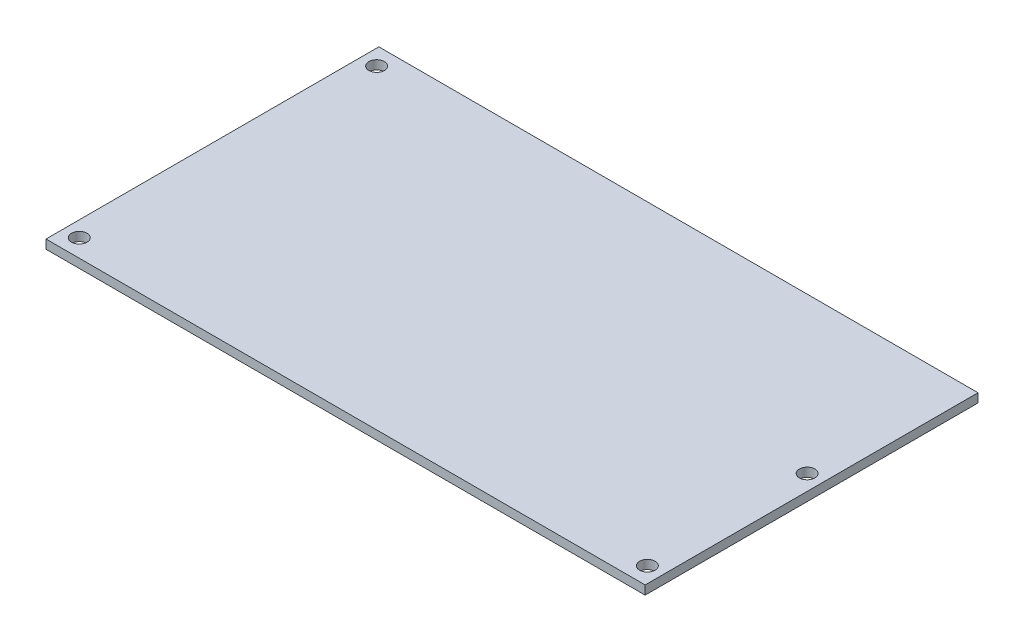
ISO-10303-21;
HEADER;
FILE_DESCRIPTION(('STEP AP214'),'2;1');
FILE_NAME('part.step','',(''),(''),'','','');
FILE_SCHEMA(('AUTOMOTIVE_DESIGN { 1 0 10303 214 1 1 1 1 }'));
ENDSEC;
DATA;
#1=APPLICATION_CONTEXT('core data for automotive mechanical design processes');
#2=APPLICATION_PROTOCOL_DEFINITION('international standard','automotive_design',2000,#1);
#3=PRODUCT_CONTEXT('',#1,'mechanical');
#4=PRODUCT('Part','Part','',(#3));
#5=PRODUCT_RELATED_PRODUCT_CATEGORY('part','',(#4));
#6=PRODUCT_DEFINITION_FORMATION('','',#4);
#7=PRODUCT_DEFINITION_CONTEXT('part definition',#1,'design');
#8=PRODUCT_DEFINITION('design','',#6,#7);
#9=PRODUCT_DEFINITION_SHAPE('','',#8);
#10=(LENGTH_UNIT() NAMED_UNIT(*) SI_UNIT(.MILLI.,.METRE.));
#11=(NAMED_UNIT(*) PLANE_ANGLE_UNIT() SI_UNIT($,.RADIAN.));
#12=(NAMED_UNIT(*) SI_UNIT($,.STERADIAN.) SOLID_ANGLE_UNIT());
#13=UNCERTAINTY_MEASURE_WITH_UNIT(LENGTH_MEASURE(1.E-05),#10,'distance_accuracy_value','');
#14=(GEOMETRIC_REPRESENTATION_CONTEXT(3) GLOBAL_UNCERTAINTY_ASSIGNED_CONTEXT((#13)) GLOBAL_UNIT_ASSIGNED_CONTEXT((#10,
#11,#12)) REPRESENTATION_CONTEXT('',''));
#15=CARTESIAN_POINT('',(0.,0.,0.));
#16=DIRECTION('',(0.,0.,1.));
#17=DIRECTION('',(1.,0.,0.));
#18=AXIS2_PLACEMENT_3D('',#15,#16,#17);
#19=CARTESIAN_POINT('',(0.,2.,0.));
#20=DIRECTION('',(0.,1.,0.));
#21=DIRECTION('',(0.,0.,1.));
#22=AXIS2_PLACEMENT_3D('',#19,#20,#21);
#23=PLANE('',#22);
#24=CARTESIAN_POINT('',(64.,2.,33.5));
#25=DIRECTION('',(0.,1.,0.));
#26=DIRECTION('',(0.,0.,1.));
#27=AXIS2_PLACEMENT_3D('',#24,#25,#26);
#28=CIRCLE('',#27,1.75);
#29=CARTESIAN_POINT('',(64.,2.,35.25));
#30=VERTEX_POINT('',#29);
#31=EDGE_CURVE('E122',#30,#30,#28,.T.);
#32=ORIENTED_EDGE('',*,*,#31,.F.);
#33=EDGE_LOOP('',(#32));
#34=FACE_BOUND('',#33,.T.);
#35=CARTESIAN_POINT('',(-64.,2.,33.5));
#36=DIRECTION('',(0.,1.,0.));
#37=DIRECTION('',(0.,0.,1.));
#38=AXIS2_PLACEMENT_3D('',#35,#36,#37);
#39=CIRCLE('',#38,1.75);
#40=CARTESIAN_POINT('',(-64.,2.,35.25));
#41=VERTEX_POINT('',#40);
#42=EDGE_CURVE('E101',#41,#41,#39,.T.);
#43=ORIENTED_EDGE('',*,*,#42,.F.);
#44=EDGE_LOOP('',(#43));
#45=FACE_BOUND('',#44,.T.);
#46=DIRECTION('',(0.,0.,-1.));
#47=VECTOR('',#46,1.);
#48=CARTESIAN_POINT('',(67.5,2.,-37.5));
#49=LINE('',#48,#47);
#50=CARTESIAN_POINT('',(67.5,2.,37.5));
#51=VERTEX_POINT('',#50);
#52=CARTESIAN_POINT('',(67.5,2.,-37.5));
#53=VERTEX_POINT('',#52);
#54=EDGE_CURVE('E86',#51,#53,#49,.T.);
#55=ORIENTED_EDGE('',*,*,#54,.T.);
#56=DIRECTION('',(-1.,0.,0.));
#57=VECTOR('',#56,1.);
#58=CARTESIAN_POINT('',(-67.5,2.,-37.5));
#59=LINE('',#58,#57);
#60=CARTESIAN_POINT('',(-67.5,2.,-37.5));
#61=VERTEX_POINT('',#60);
#62=EDGE_CURVE('E81',#53,#61,#59,.T.);
#63=ORIENTED_EDGE('',*,*,#62,.T.);
#64=DIRECTION('',(0.,0.,1.));
#65=VECTOR('',#64,1.);
#66=CARTESIAN_POINT('',(-67.5,2.,-37.5));
#67=LINE('',#66,#65);
#68=CARTESIAN_POINT('',(-67.5,2.,37.5));
#69=VERTEX_POINT('',#68);
#70=EDGE_CURVE('E84',#61,#69,#67,.T.);
#71=ORIENTED_EDGE('',*,*,#70,.T.);
#72=DIRECTION('',(1.,0.,0.));
#73=VECTOR('',#72,1.);
#74=CARTESIAN_POINT('',(-67.5,2.,37.5));
#75=LINE('',#74,#73);
#76=EDGE_CURVE('E51',#69,#51,#75,.T.);
#77=ORIENTED_EDGE('',*,*,#76,.T.);
#78=EDGE_LOOP('',(#55,#63,#71,#77));
#79=FACE_BOUND('',#78,.T.);
#80=CARTESIAN_POINT('',(-64.,2.,-33.5));
#81=DIRECTION('',(0.,1.,0.));
#82=DIRECTION('',(0.,0.,1.));
#83=AXIS2_PLACEMENT_3D('',#80,#81,#82);
#84=CIRCLE('',#83,1.75);
#85=CARTESIAN_POINT('',(-64.,2.,-31.75));
#86=VERTEX_POINT('',#85);
#87=EDGE_CURVE('E116',#86,#86,#84,.T.);
#88=ORIENTED_EDGE('',*,*,#87,.F.);
#89=EDGE_LOOP('',(#88));
#90=FACE_BOUND('',#89,.T.);
#91=CARTESIAN_POINT('',(64.,2.,-2.5));
#92=DIRECTION('',(0.,1.,0.));
#93=DIRECTION('',(0.,0.,1.));
#94=AXIS2_PLACEMENT_3D('',#91,#92,#93);
#95=CIRCLE('',#94,1.75);
#96=CARTESIAN_POINT('',(64.,2.,-0.749999999999998));
#97=VERTEX_POINT('',#96);
#98=EDGE_CURVE('E128',#97,#97,#95,.T.);
#99=ORIENTED_EDGE('',*,*,#98,.F.);
#100=EDGE_LOOP('',(#99));
#101=FACE_BOUND('',#100,.T.);
#102=ADVANCED_FACE('F34',(#34,#45,#79,#90,#101),#23,.T.);
#103=CARTESIAN_POINT('',(0.,0.,0.));
#104=DIRECTION('',(0.,1.,0.));
#105=DIRECTION('',(0.,0.,1.));
#106=AXIS2_PLACEMENT_3D('',#103,#104,#105);
#107=PLANE('',#106);
#108=DIRECTION('',(0.,0.,-1.));
#109=VECTOR('',#108,1.);
#110=CARTESIAN_POINT('',(67.5,0.,-37.5));
#111=LINE('',#110,#109);
#112=CARTESIAN_POINT('',(67.5,0.,37.5));
#113=VERTEX_POINT('',#112);
#114=CARTESIAN_POINT('',(67.5,0.,-37.5));
#115=VERTEX_POINT('',#114);
#116=EDGE_CURVE('E98',#113,#115,#111,.T.);
#117=ORIENTED_EDGE('',*,*,#116,.F.);
#118=DIRECTION('',(1.,0.,0.));
#119=VECTOR('',#118,1.);
#120=CARTESIAN_POINT('',(-67.5,0.,37.5));
#121=LINE('',#120,#119);
#122=CARTESIAN_POINT('',(-67.5,0.,37.5));
#123=VERTEX_POINT('',#122);
#124=EDGE_CURVE('E74',#123,#113,#121,.T.);
#125=ORIENTED_EDGE('',*,*,#124,.F.);
#126=DIRECTION('',(0.,0.,1.));
#127=VECTOR('',#126,1.);
#128=CARTESIAN_POINT('',(-67.5,0.,-37.5));
#129=LINE('',#128,#127);
#130=CARTESIAN_POINT('',(-67.5,0.,-37.5));
#131=VERTEX_POINT('',#130);
#132=EDGE_CURVE('E68',#131,#123,#129,.T.);
#133=ORIENTED_EDGE('',*,*,#132,.F.);
#134=DIRECTION('',(-1.,0.,0.));
#135=VECTOR('',#134,1.);
#136=CARTESIAN_POINT('',(-67.5,0.,-37.5));
#137=LINE('',#136,#135);
#138=EDGE_CURVE('E90',#115,#131,#137,.T.);
#139=ORIENTED_EDGE('',*,*,#138,.F.);
#140=EDGE_LOOP('',(#117,#125,#133,#139));
#141=FACE_BOUND('',#140,.T.);
#142=CARTESIAN_POINT('',(-64.,0.,33.5));
#143=DIRECTION('',(0.,1.,0.));
#144=DIRECTION('',(0.,0.,1.));
#145=AXIS2_PLACEMENT_3D('',#142,#143,#144);
#146=CIRCLE('',#145,1.75);
#147=CARTESIAN_POINT('',(-64.,0.,35.25));
#148=VERTEX_POINT('',#147);
#149=EDGE_CURVE('E113',#148,#148,#146,.T.);
#150=ORIENTED_EDGE('',*,*,#149,.T.);
#151=EDGE_LOOP('',(#150));
#152=FACE_BOUND('',#151,.T.);
#153=CARTESIAN_POINT('',(-64.,0.,-33.5));
#154=DIRECTION('',(0.,1.,0.));
#155=DIRECTION('',(0.,0.,1.));
#156=AXIS2_PLACEMENT_3D('',#153,#154,#155);
#157=CIRCLE('',#156,1.75);
#158=CARTESIAN_POINT('',(-64.,0.,-31.75));
#159=VERTEX_POINT('',#158);
#160=EDGE_CURVE('E119',#159,#159,#157,.T.);
#161=ORIENTED_EDGE('',*,*,#160,.T.);
#162=EDGE_LOOP('',(#161));
#163=FACE_BOUND('',#162,.T.);
#164=CARTESIAN_POINT('',(64.,0.,33.5));
#165=DIRECTION('',(0.,1.,0.));
#166=DIRECTION('',(0.,0.,1.));
#167=AXIS2_PLACEMENT_3D('',#164,#165,#166);
#168=CIRCLE('',#167,1.75);
#169=CARTESIAN_POINT('',(64.,0.,35.25));
#170=VERTEX_POINT('',#169);
#171=EDGE_CURVE('E125',#170,#170,#168,.T.);
#172=ORIENTED_EDGE('',*,*,#171,.T.);
#173=EDGE_LOOP('',(#172));
#174=FACE_BOUND('',#173,.T.);
#175=CARTESIAN_POINT('',(64.,0.,-2.5));
#176=DIRECTION('',(0.,1.,0.));
#177=DIRECTION('',(0.,0.,1.));
#178=AXIS2_PLACEMENT_3D('',#175,#176,#177);
#179=CIRCLE('',#178,1.75);
#180=CARTESIAN_POINT('',(64.,0.,-0.749999999999998));
#181=VERTEX_POINT('',#180);
#182=EDGE_CURVE('E131',#181,#181,#179,.T.);
#183=ORIENTED_EDGE('',*,*,#182,.T.);
#184=EDGE_LOOP('',(#183));
#185=FACE_BOUND('',#184,.T.);
#186=ADVANCED_FACE('F109',(#141,#152,#163,#174,#185),#107,.F.);
#187=CARTESIAN_POINT('',(67.5,2.,-37.5));
#188=DIRECTION('',(-1.,0.,0.));
#189=DIRECTION('',(0.,0.,1.));
#190=AXIS2_PLACEMENT_3D('',#187,#188,#189);
#191=PLANE('',#190);
#192=ORIENTED_EDGE('',*,*,#116,.T.);
#193=DIRECTION('',(0.,-1.,0.));
#194=VECTOR('',#193,1.);
#195=CARTESIAN_POINT('',(67.5,2.,-37.5));
#196=LINE('',#195,#194);
#197=EDGE_CURVE('E11',#53,#115,#196,.T.);
#198=ORIENTED_EDGE('',*,*,#197,.F.);
#199=ORIENTED_EDGE('',*,*,#54,.F.);
#200=DIRECTION('',(0.,-1.,0.));
#201=VECTOR('',#200,1.);
#202=CARTESIAN_POINT('',(67.5,2.,37.5));
#203=LINE('',#202,#201);
#204=EDGE_CURVE('E94',#51,#113,#203,.T.);
#205=ORIENTED_EDGE('',*,*,#204,.T.);
#206=EDGE_LOOP('',(#192,#198,#199,#205));
#207=FACE_BOUND('',#206,.T.);
#208=ADVANCED_FACE('F36',(#207),#191,.F.);
#209=CARTESIAN_POINT('',(-67.5,2.,-37.5));
#210=DIRECTION('',(0.,0.,1.));
#211=DIRECTION('',(1.,0.,0.));
#212=AXIS2_PLACEMENT_3D('',#209,#210,#211);
#213=PLANE('',#212);
#214=ORIENTED_EDGE('',*,*,#138,.T.);
#215=DIRECTION('',(0.,-1.,0.));
#216=VECTOR('',#215,1.);
#217=CARTESIAN_POINT('',(-67.5,2.,-37.5));
#218=LINE('',#217,#216);
#219=EDGE_CURVE('E43',#61,#131,#218,.T.);
#220=ORIENTED_EDGE('',*,*,#219,.F.);
#221=ORIENTED_EDGE('',*,*,#62,.F.);
#222=ORIENTED_EDGE('',*,*,#197,.T.);
#223=EDGE_LOOP('',(#214,#220,#221,#222));
#224=FACE_BOUND('',#223,.T.);
#225=ADVANCED_FACE('F89',(#224),#213,.F.);
#226=CARTESIAN_POINT('',(-67.5,2.,-37.5));
#227=DIRECTION('',(1.,0.,0.));
#228=DIRECTION('',(0.,0.,-1.));
#229=AXIS2_PLACEMENT_3D('',#226,#227,#228);
#230=PLANE('',#229);
#231=ORIENTED_EDGE('',*,*,#132,.T.);
#232=DIRECTION('',(0.,-1.,0.));
#233=VECTOR('',#232,1.);
#234=CARTESIAN_POINT('',(-67.5,2.,37.5));
#235=LINE('',#234,#233);
#236=EDGE_CURVE('E91',#69,#123,#235,.T.);
#237=ORIENTED_EDGE('',*,*,#236,.F.);
#238=ORIENTED_EDGE('',*,*,#70,.F.);
#239=ORIENTED_EDGE('',*,*,#219,.T.);
#240=EDGE_LOOP('',(#231,#237,#238,#239));
#241=FACE_BOUND('',#240,.T.);
#242=ADVANCED_FACE('F92',(#241),#230,.F.);
#243=CARTESIAN_POINT('',(-67.5,2.,37.5));
#244=DIRECTION('',(0.,0.,-1.));
#245=DIRECTION('',(-1.,0.,0.));
#246=AXIS2_PLACEMENT_3D('',#243,#244,#245);
#247=PLANE('',#246);
#248=ORIENTED_EDGE('',*,*,#124,.T.);
#249=ORIENTED_EDGE('',*,*,#204,.F.);
#250=ORIENTED_EDGE('',*,*,#76,.F.);
#251=ORIENTED_EDGE('',*,*,#236,.T.);
#252=EDGE_LOOP('',(#248,#249,#250,#251));
#253=FACE_BOUND('',#252,.T.);
#254=ADVANCED_FACE('F106',(#253),#247,.F.);
#255=CARTESIAN_POINT('',(-64.,2.,33.5));
#256=DIRECTION('',(0.,-1.,0.));
#257=DIRECTION('',(0.,0.,-1.));
#258=AXIS2_PLACEMENT_3D('',#255,#256,#257);
#259=CYLINDRICAL_SURFACE('',#258,1.75);
#260=ORIENTED_EDGE('',*,*,#42,.T.);
#261=EDGE_LOOP('',(#260));
#262=FACE_BOUND('',#261,.T.);
#263=ORIENTED_EDGE('',*,*,#149,.F.);
#264=EDGE_LOOP('',(#263));
#265=FACE_BOUND('',#264,.T.);
#266=ADVANCED_FACE('F150',(#262,#265),#259,.F.);
#267=CARTESIAN_POINT('',(-64.,2.,-33.5));
#268=DIRECTION('',(0.,-1.,0.));
#269=DIRECTION('',(0.,0.,-1.));
#270=AXIS2_PLACEMENT_3D('',#267,#268,#269);
#271=CYLINDRICAL_SURFACE('',#270,1.75);
#272=ORIENTED_EDGE('',*,*,#87,.T.);
#273=EDGE_LOOP('',(#272));
#274=FACE_BOUND('',#273,.T.);
#275=ORIENTED_EDGE('',*,*,#160,.F.);
#276=EDGE_LOOP('',(#275));
#277=FACE_BOUND('',#276,.T.);
#278=ADVANCED_FACE('F196',(#274,#277),#271,.F.);
#279=CARTESIAN_POINT('',(64.,2.,33.5));
#280=DIRECTION('',(0.,-1.,0.));
#281=DIRECTION('',(0.,0.,-1.));
#282=AXIS2_PLACEMENT_3D('',#279,#280,#281);
#283=CYLINDRICAL_SURFACE('',#282,1.75);
#284=ORIENTED_EDGE('',*,*,#31,.T.);
#285=EDGE_LOOP('',(#284));
#286=FACE_BOUND('',#285,.T.);
#287=ORIENTED_EDGE('',*,*,#171,.F.);
#288=EDGE_LOOP('',(#287));
#289=FACE_BOUND('',#288,.T.);
#290=ADVANCED_FACE('F204',(#286,#289),#283,.F.);
#291=CARTESIAN_POINT('',(64.,2.,-2.5));
#292=DIRECTION('',(0.,-1.,0.));
#293=DIRECTION('',(0.,0.,-1.));
#294=AXIS2_PLACEMENT_3D('',#291,#292,#293);
#295=CYLINDRICAL_SURFACE('',#294,1.75);
#296=ORIENTED_EDGE('',*,*,#98,.T.);
#297=EDGE_LOOP('',(#296));
#298=FACE_BOUND('',#297,.T.);
#299=ORIENTED_EDGE('',*,*,#182,.F.);
#300=EDGE_LOOP('',(#299));
#301=FACE_BOUND('',#300,.T.);
#302=ADVANCED_FACE('F137',(#298,#301),#295,.F.);
#303=CLOSED_SHELL('',(#102,#186,#208,#225,#242,#254,#266,#278,#290,#302));
#304=MANIFOLD_SOLID_BREP('B2',#303);
#305=ADVANCED_BREP_SHAPE_REPRESENTATION('',(#18,#304),#14);
#306=SHAPE_DEFINITION_REPRESENTATION(#9,#305);
ENDSEC;
END-ISO-10303-21;
